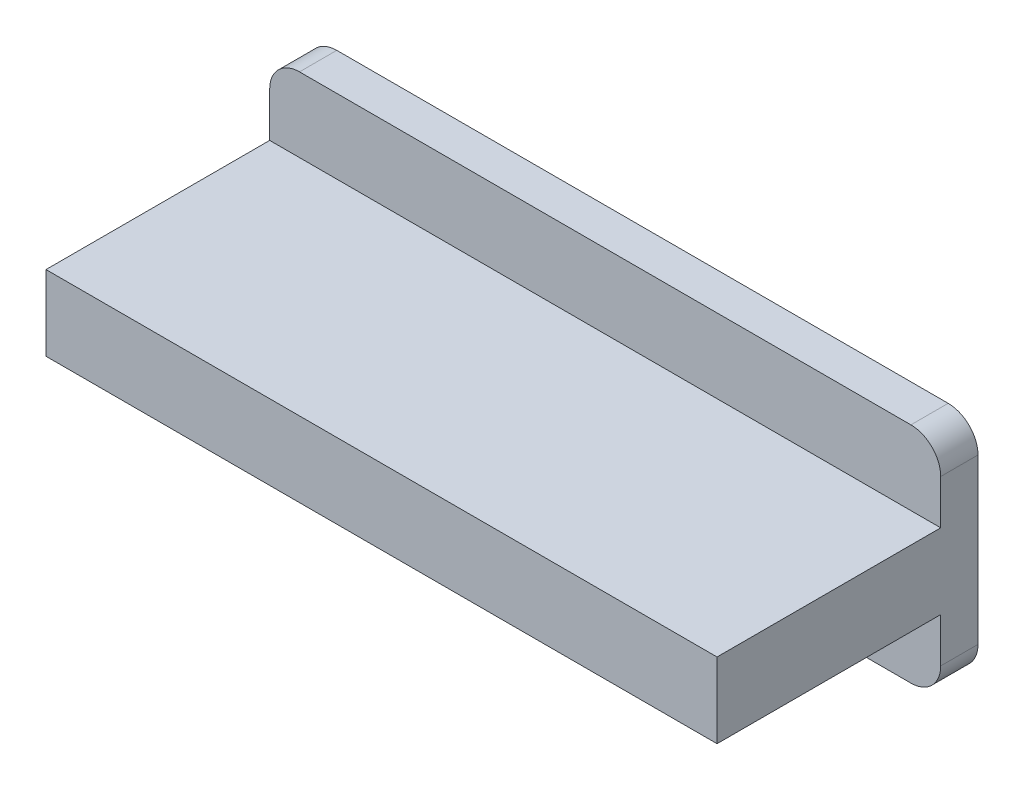
ISO-10303-21;
HEADER;
FILE_DESCRIPTION(('STEP AP214'),'2;1');
FILE_NAME('part.step','',(''),(''),'','','');
FILE_SCHEMA(('AUTOMOTIVE_DESIGN { 1 0 10303 214 1 1 1 1 }'));
ENDSEC;
DATA;
#1=APPLICATION_CONTEXT('core data for automotive mechanical design processes');
#2=APPLICATION_PROTOCOL_DEFINITION('international standard','automotive_design',2000,#1);
#3=PRODUCT_CONTEXT('',#1,'mechanical');
#4=PRODUCT('Part','Part','',(#3));
#5=PRODUCT_RELATED_PRODUCT_CATEGORY('part','',(#4));
#6=PRODUCT_DEFINITION_FORMATION('','',#4);
#7=PRODUCT_DEFINITION_CONTEXT('part definition',#1,'design');
#8=PRODUCT_DEFINITION('design','',#6,#7);
#9=PRODUCT_DEFINITION_SHAPE('','',#8);
#10=(LENGTH_UNIT() NAMED_UNIT(*) SI_UNIT(.MILLI.,.METRE.));
#11=(NAMED_UNIT(*) PLANE_ANGLE_UNIT() SI_UNIT($,.RADIAN.));
#12=(NAMED_UNIT(*) SI_UNIT($,.STERADIAN.) SOLID_ANGLE_UNIT());
#13=UNCERTAINTY_MEASURE_WITH_UNIT(LENGTH_MEASURE(1.E-05),#10,'distance_accuracy_value','');
#14=(GEOMETRIC_REPRESENTATION_CONTEXT(3) GLOBAL_UNCERTAINTY_ASSIGNED_CONTEXT((#13)) GLOBAL_UNIT_ASSIGNED_CONTEXT((#10,
#11,#12)) REPRESENTATION_CONTEXT('',''));
#15=CARTESIAN_POINT('',(0.,0.,0.));
#16=DIRECTION('',(0.,0.,1.));
#17=DIRECTION('',(1.,0.,0.));
#18=AXIS2_PLACEMENT_3D('',#15,#16,#17);
#19=CARTESIAN_POINT('',(0.,0.,3.175));
#20=DIRECTION('',(0.,0.,-1.));
#21=DIRECTION('',(-1.,0.,0.));
#22=AXIS2_PLACEMENT_3D('',#19,#20,#21);
#23=PLANE('',#22);
#24=DIRECTION('',(0.,-1.,0.));
#25=VECTOR('',#24,1.);
#26=CARTESIAN_POINT('',(-28.575,-9.525,3.175));
#27=LINE('',#26,#25);
#28=CARTESIAN_POINT('',(-28.575,-3.19935897435899,3.175));
#29=VERTEX_POINT('',#28);
#30=CARTESIAN_POINT('',(-28.575,-6.985,3.175));
#31=VERTEX_POINT('',#30);
#32=EDGE_CURVE('E169',#29,#31,#27,.T.);
#33=ORIENTED_EDGE('',*,*,#32,.T.);
#34=CARTESIAN_POINT('',(-26.035,-6.985,3.175));
#35=DIRECTION('',(0.,0.,-1.));
#36=DIRECTION('',(-1.,0.,0.));
#37=AXIS2_PLACEMENT_3D('',#34,#35,#36);
#38=CIRCLE('',#37,2.54);
#39=CARTESIAN_POINT('',(-26.035,-9.525,3.175));
#40=VERTEX_POINT('',#39);
#41=EDGE_CURVE('E202',#31,#40,#38,.F.);
#42=ORIENTED_EDGE('',*,*,#41,.T.);
#43=DIRECTION('',(1.,0.,0.));
#44=VECTOR('',#43,1.);
#45=CARTESIAN_POINT('',(-28.575,-9.525,3.175));
#46=LINE('',#45,#44);
#47=CARTESIAN_POINT('',(26.035,-9.525,3.175));
#48=VERTEX_POINT('',#47);
#49=EDGE_CURVE('E172',#40,#48,#46,.T.);
#50=ORIENTED_EDGE('',*,*,#49,.T.);
#51=CARTESIAN_POINT('',(26.035,-6.985,3.175));
#52=DIRECTION('',(0.,0.,-1.));
#53=DIRECTION('',(-1.,0.,0.));
#54=AXIS2_PLACEMENT_3D('',#51,#52,#53);
#55=CIRCLE('',#54,2.54);
#56=CARTESIAN_POINT('',(28.575,-6.985,3.175));
#57=VERTEX_POINT('',#56);
#58=EDGE_CURVE('E200',#48,#57,#55,.F.);
#59=ORIENTED_EDGE('',*,*,#58,.T.);
#60=DIRECTION('',(0.,1.,0.));
#61=VECTOR('',#60,1.);
#62=CARTESIAN_POINT('',(28.575,-9.525,3.175));
#63=LINE('',#62,#61);
#64=CARTESIAN_POINT('',(28.575,-3.19935897435899,3.175));
#65=VERTEX_POINT('',#64);
#66=EDGE_CURVE('E165',#57,#65,#63,.T.);
#67=ORIENTED_EDGE('',*,*,#66,.T.);
#68=DIRECTION('',(1.,0.,0.));
#69=VECTOR('',#68,1.);
#70=CARTESIAN_POINT('',(-28.575,-3.19935897435899,3.175));
#71=LINE('',#70,#69);
#72=EDGE_CURVE('E153',#29,#65,#71,.T.);
#73=ORIENTED_EDGE('',*,*,#72,.F.);
#74=EDGE_LOOP('',(#33,#42,#50,#59,#67,#73));
#75=FACE_BOUND('',#74,.T.);
#76=ADVANCED_FACE('F43',(#75),#23,.F.);
#77=DIRECTION('',(-1.,0.,0.));
#78=VECTOR('',#77,1.);
#79=CARTESIAN_POINT('',(-28.575,9.525,3.175));
#80=LINE('',#79,#78);
#81=CARTESIAN_POINT('',(26.035,9.525,3.175));
#82=VERTEX_POINT('',#81);
#83=CARTESIAN_POINT('',(-26.035,9.525,3.175));
#84=VERTEX_POINT('',#83);
#85=EDGE_CURVE('E167',#82,#84,#80,.T.);
#86=ORIENTED_EDGE('',*,*,#85,.T.);
#87=CARTESIAN_POINT('',(-26.035,6.985,3.175));
#88=DIRECTION('',(0.,0.,-1.));
#89=DIRECTION('',(-1.,0.,0.));
#90=AXIS2_PLACEMENT_3D('',#87,#88,#89);
#91=CIRCLE('',#90,2.54);
#92=CARTESIAN_POINT('',(-28.575,6.98499999999999,3.175));
#93=VERTEX_POINT('',#92);
#94=EDGE_CURVE('E210',#84,#93,#91,.F.);
#95=ORIENTED_EDGE('',*,*,#94,.T.);
#96=CARTESIAN_POINT('',(-28.575,3.19935897435899,3.175));
#97=VERTEX_POINT('',#96);
#98=EDGE_CURVE('E170',#93,#97,#27,.T.);
#99=ORIENTED_EDGE('',*,*,#98,.T.);
#100=DIRECTION('',(-1.,0.,0.));
#101=VECTOR('',#100,1.);
#102=CARTESIAN_POINT('',(-28.575,3.19935897435899,3.175));
#103=LINE('',#102,#101);
#104=CARTESIAN_POINT('',(28.575,3.19935897435898,3.175));
#105=VERTEX_POINT('',#104);
#106=EDGE_CURVE('E369',#105,#97,#103,.T.);
#107=ORIENTED_EDGE('',*,*,#106,.F.);
#108=CARTESIAN_POINT('',(28.575,6.98499999999999,3.175));
#109=VERTEX_POINT('',#108);
#110=EDGE_CURVE('E156',#105,#109,#63,.T.);
#111=ORIENTED_EDGE('',*,*,#110,.T.);
#112=CARTESIAN_POINT('',(26.035,6.985,3.175));
#113=DIRECTION('',(0.,0.,-1.));
#114=DIRECTION('',(-1.,0.,0.));
#115=AXIS2_PLACEMENT_3D('',#112,#113,#114);
#116=CIRCLE('',#115,2.54);
#117=EDGE_CURVE('E208',#109,#82,#116,.F.);
#118=ORIENTED_EDGE('',*,*,#117,.T.);
#119=EDGE_LOOP('',(#86,#95,#99,#107,#111,#118));
#120=FACE_BOUND('',#119,.T.);
#121=ADVANCED_FACE('F228',(#120),#23,.F.);
#122=CARTESIAN_POINT('',(28.575,-9.525,3.175));
#123=DIRECTION('',(-1.,0.,0.));
#124=DIRECTION('',(0.,0.,1.));
#125=AXIS2_PLACEMENT_3D('',#122,#123,#124);
#126=PLANE('',#125);
#127=DIRECTION('',(0.,1.,0.));
#128=VECTOR('',#127,1.);
#129=CARTESIAN_POINT('',(28.575,-9.525,0.));
#130=LINE('',#129,#128);
#131=CARTESIAN_POINT('',(28.575,-6.985,0.));
#132=VERTEX_POINT('',#131);
#133=CARTESIAN_POINT('',(28.575,6.98499999999999,0.));
#134=VERTEX_POINT('',#133);
#135=EDGE_CURVE('E157',#132,#134,#130,.T.);
#136=ORIENTED_EDGE('',*,*,#135,.T.);
#137=DIRECTION('',(0.,0.,-1.));
#138=VECTOR('',#137,1.);
#139=CARTESIAN_POINT('',(28.575,6.985,3.175));
#140=LINE('',#139,#138);
#141=EDGE_CURVE('E11',#134,#109,#140,.F.);
#142=ORIENTED_EDGE('',*,*,#141,.T.);
#143=ORIENTED_EDGE('',*,*,#110,.F.);
#144=DIRECTION('',(0.,0.,-1.));
#145=VECTOR('',#144,1.);
#146=CARTESIAN_POINT('',(28.575,3.19935897435899,22.225));
#147=LINE('',#146,#145);
#148=CARTESIAN_POINT('',(28.575,3.19935897435899,22.225));
#149=VERTEX_POINT('',#148);
#150=EDGE_CURVE('E139',#149,#105,#147,.T.);
#151=ORIENTED_EDGE('',*,*,#150,.F.);
#152=DIRECTION('',(0.,1.,0.));
#153=VECTOR('',#152,1.);
#154=CARTESIAN_POINT('',(28.575,-3.19935897435899,22.225));
#155=LINE('',#154,#153);
#156=CARTESIAN_POINT('',(28.575,-3.19935897435899,22.225));
#157=VERTEX_POINT('',#156);
#158=EDGE_CURVE('E145',#157,#149,#155,.T.);
#159=ORIENTED_EDGE('',*,*,#158,.F.);
#160=DIRECTION('',(0.,0.,-1.));
#161=VECTOR('',#160,1.);
#162=CARTESIAN_POINT('',(28.575,-3.19935897435899,22.225));
#163=LINE('',#162,#161);
#164=EDGE_CURVE('E366',#157,#65,#163,.T.);
#165=ORIENTED_EDGE('',*,*,#164,.T.);
#166=ORIENTED_EDGE('',*,*,#66,.F.);
#167=DIRECTION('',(0.,0.,-1.));
#168=VECTOR('',#167,1.);
#169=CARTESIAN_POINT('',(28.575,-6.985,3.175));
#170=LINE('',#169,#168);
#171=EDGE_CURVE('E51',#57,#132,#170,.T.);
#172=ORIENTED_EDGE('',*,*,#171,.T.);
#173=EDGE_LOOP('',(#136,#142,#143,#151,#159,#165,#166,#172));
#174=FACE_BOUND('',#173,.T.);
#175=ADVANCED_FACE('F155',(#174),#126,.F.);
#176=CARTESIAN_POINT('',(-28.575,9.525,3.175));
#177=DIRECTION('',(0.,-1.,0.));
#178=DIRECTION('',(0.,0.,-1.));
#179=AXIS2_PLACEMENT_3D('',#176,#177,#178);
#180=PLANE('',#179);
#181=DIRECTION('',(-1.,0.,0.));
#182=VECTOR('',#181,1.);
#183=CARTESIAN_POINT('',(-28.575,9.525,0.));
#184=LINE('',#183,#182);
#185=CARTESIAN_POINT('',(26.035,9.525,0.));
#186=VERTEX_POINT('',#185);
#187=CARTESIAN_POINT('',(-26.035,9.525,0.));
#188=VERTEX_POINT('',#187);
#189=EDGE_CURVE('E159',#186,#188,#184,.T.);
#190=ORIENTED_EDGE('',*,*,#189,.T.);
#191=DIRECTION('',(0.,0.,-1.));
#192=VECTOR('',#191,1.);
#193=CARTESIAN_POINT('',(-26.035,9.525,3.175));
#194=LINE('',#193,#192);
#195=EDGE_CURVE('E64',#188,#84,#194,.F.);
#196=ORIENTED_EDGE('',*,*,#195,.T.);
#197=ORIENTED_EDGE('',*,*,#85,.F.);
#198=DIRECTION('',(0.,0.,-1.));
#199=VECTOR('',#198,1.);
#200=CARTESIAN_POINT('',(26.035,9.525,3.175));
#201=LINE('',#200,#199);
#202=EDGE_CURVE('E204',#82,#186,#201,.T.);
#203=ORIENTED_EDGE('',*,*,#202,.T.);
#204=EDGE_LOOP('',(#190,#196,#197,#203));
#205=FACE_BOUND('',#204,.T.);
#206=ADVANCED_FACE('F225',(#205),#180,.F.);
#207=CARTESIAN_POINT('',(-28.575,-9.525,3.175));
#208=DIRECTION('',(1.,0.,0.));
#209=DIRECTION('',(0.,0.,-1.));
#210=AXIS2_PLACEMENT_3D('',#207,#208,#209);
#211=PLANE('',#210);
#212=DIRECTION('',(0.,-1.,0.));
#213=VECTOR('',#212,1.);
#214=CARTESIAN_POINT('',(-28.575,-9.525,0.));
#215=LINE('',#214,#213);
#216=CARTESIAN_POINT('',(-28.575,6.98499999999999,0.));
#217=VERTEX_POINT('',#216);
#218=CARTESIAN_POINT('',(-28.575,-6.985,0.));
#219=VERTEX_POINT('',#218);
#220=EDGE_CURVE('E177',#217,#219,#215,.T.);
#221=ORIENTED_EDGE('',*,*,#220,.T.);
#222=DIRECTION('',(0.,0.,-1.));
#223=VECTOR('',#222,1.);
#224=CARTESIAN_POINT('',(-28.575,-6.985,3.175));
#225=LINE('',#224,#223);
#226=EDGE_CURVE('E198',#219,#31,#225,.F.);
#227=ORIENTED_EDGE('',*,*,#226,.T.);
#228=ORIENTED_EDGE('',*,*,#32,.F.);
#229=DIRECTION('',(0.,0.,-1.));
#230=VECTOR('',#229,1.);
#231=CARTESIAN_POINT('',(-28.575,-3.19935897435899,22.225));
#232=LINE('',#231,#230);
#233=CARTESIAN_POINT('',(-28.575,-3.19935897435899,22.225));
#234=VERTEX_POINT('',#233);
#235=EDGE_CURVE('E161',#234,#29,#232,.T.);
#236=ORIENTED_EDGE('',*,*,#235,.F.);
#237=DIRECTION('',(0.,-1.,0.));
#238=VECTOR('',#237,1.);
#239=CARTESIAN_POINT('',(-28.575,-3.19935897435899,22.225));
#240=LINE('',#239,#238);
#241=CARTESIAN_POINT('',(-28.575,3.19935897435899,22.225));
#242=VERTEX_POINT('',#241);
#243=EDGE_CURVE('E144',#242,#234,#240,.T.);
#244=ORIENTED_EDGE('',*,*,#243,.F.);
#245=DIRECTION('',(0.,0.,-1.));
#246=VECTOR('',#245,1.);
#247=CARTESIAN_POINT('',(-28.575,3.19935897435899,22.225));
#248=LINE('',#247,#246);
#249=EDGE_CURVE('E141',#242,#97,#248,.T.);
#250=ORIENTED_EDGE('',*,*,#249,.T.);
#251=ORIENTED_EDGE('',*,*,#98,.F.);
#252=DIRECTION('',(0.,0.,-1.));
#253=VECTOR('',#252,1.);
#254=CARTESIAN_POINT('',(-28.575,6.985,3.175));
#255=LINE('',#254,#253);
#256=EDGE_CURVE('E195',#93,#217,#255,.T.);
#257=ORIENTED_EDGE('',*,*,#256,.T.);
#258=EDGE_LOOP('',(#221,#227,#228,#236,#244,#250,#251,#257));
#259=FACE_BOUND('',#258,.T.);
#260=ADVANCED_FACE('F235',(#259),#211,.F.);
#261=CARTESIAN_POINT('',(-28.575,-9.525,3.175));
#262=DIRECTION('',(0.,1.,0.));
#263=DIRECTION('',(0.,0.,1.));
#264=AXIS2_PLACEMENT_3D('',#261,#262,#263);
#265=PLANE('',#264);
#266=ORIENTED_EDGE('',*,*,#49,.F.);
#267=DIRECTION('',(0.,0.,-1.));
#268=VECTOR('',#267,1.);
#269=CARTESIAN_POINT('',(-26.035,-9.525,3.175));
#270=LINE('',#269,#268);
#271=CARTESIAN_POINT('',(-26.035,-9.525,0.));
#272=VERTEX_POINT('',#271);
#273=EDGE_CURVE('E184',#40,#272,#270,.T.);
#274=ORIENTED_EDGE('',*,*,#273,.T.);
#275=DIRECTION('',(1.,0.,0.));
#276=VECTOR('',#275,1.);
#277=CARTESIAN_POINT('',(-28.575,-9.525,0.));
#278=LINE('',#277,#276);
#279=CARTESIAN_POINT('',(26.035,-9.525,0.));
#280=VERTEX_POINT('',#279);
#281=EDGE_CURVE('E180',#272,#280,#278,.T.);
#282=ORIENTED_EDGE('',*,*,#281,.T.);
#283=DIRECTION('',(0.,0.,-1.));
#284=VECTOR('',#283,1.);
#285=CARTESIAN_POINT('',(26.035,-9.525,3.175));
#286=LINE('',#285,#284);
#287=EDGE_CURVE('E174',#280,#48,#286,.F.);
#288=ORIENTED_EDGE('',*,*,#287,.T.);
#289=EDGE_LOOP('',(#266,#274,#282,#288));
#290=FACE_BOUND('',#289,.T.);
#291=ADVANCED_FACE('F243',(#290),#265,.F.);
#292=CARTESIAN_POINT('',(0.,0.,0.));
#293=DIRECTION('',(0.,0.,-1.));
#294=DIRECTION('',(-1.,0.,0.));
#295=AXIS2_PLACEMENT_3D('',#292,#293,#294);
#296=PLANE('',#295);
#297=ORIENTED_EDGE('',*,*,#281,.F.);
#298=CARTESIAN_POINT('',(-26.035,-6.985,0.));
#299=DIRECTION('',(0.,0.,-1.));
#300=DIRECTION('',(-1.,0.,0.));
#301=AXIS2_PLACEMENT_3D('',#298,#299,#300);
#302=CIRCLE('',#301,2.54);
#303=EDGE_CURVE('E193',#272,#219,#302,.T.);
#304=ORIENTED_EDGE('',*,*,#303,.T.);
#305=ORIENTED_EDGE('',*,*,#220,.F.);
#306=CARTESIAN_POINT('',(-26.035,6.985,0.));
#307=DIRECTION('',(0.,0.,-1.));
#308=DIRECTION('',(-1.,0.,0.));
#309=AXIS2_PLACEMENT_3D('',#306,#307,#308);
#310=CIRCLE('',#309,2.54);
#311=EDGE_CURVE('E191',#217,#188,#310,.T.);
#312=ORIENTED_EDGE('',*,*,#311,.T.);
#313=ORIENTED_EDGE('',*,*,#189,.F.);
#314=CARTESIAN_POINT('',(26.035,6.985,0.));
#315=DIRECTION('',(0.,0.,-1.));
#316=DIRECTION('',(-1.,0.,0.));
#317=AXIS2_PLACEMENT_3D('',#314,#315,#316);
#318=CIRCLE('',#317,2.54);
#319=EDGE_CURVE('E189',#186,#134,#318,.T.);
#320=ORIENTED_EDGE('',*,*,#319,.T.);
#321=ORIENTED_EDGE('',*,*,#135,.F.);
#322=CARTESIAN_POINT('',(26.035,-6.985,0.));
#323=DIRECTION('',(0.,0.,-1.));
#324=DIRECTION('',(-1.,0.,0.));
#325=AXIS2_PLACEMENT_3D('',#322,#323,#324);
#326=CIRCLE('',#325,2.54);
#327=EDGE_CURVE('E187',#132,#280,#326,.T.);
#328=ORIENTED_EDGE('',*,*,#327,.T.);
#329=EDGE_LOOP('',(#297,#304,#305,#312,#313,#320,#321,#328));
#330=FACE_BOUND('',#329,.T.);
#331=ADVANCED_FACE('F219',(#330),#296,.T.);
#332=CARTESIAN_POINT('',(-28.575,3.19935897435899,22.225));
#333=DIRECTION('',(0.,-1.,0.));
#334=DIRECTION('',(0.,0.,-1.));
#335=AXIS2_PLACEMENT_3D('',#332,#333,#334);
#336=PLANE('',#335);
#337=ORIENTED_EDGE('',*,*,#106,.T.);
#338=ORIENTED_EDGE('',*,*,#249,.F.);
#339=DIRECTION('',(-1.,0.,0.));
#340=VECTOR('',#339,1.);
#341=CARTESIAN_POINT('',(-28.575,3.19935897435899,22.225));
#342=LINE('',#341,#340);
#343=EDGE_CURVE('E134',#149,#242,#342,.T.);
#344=ORIENTED_EDGE('',*,*,#343,.F.);
#345=ORIENTED_EDGE('',*,*,#150,.T.);
#346=EDGE_LOOP('',(#337,#338,#344,#345));
#347=FACE_BOUND('',#346,.T.);
#348=ADVANCED_FACE('F137',(#347),#336,.F.);
#349=CARTESIAN_POINT('',(-28.575,-3.19935897435899,22.225));
#350=DIRECTION('',(0.,1.,0.));
#351=DIRECTION('',(0.,0.,1.));
#352=AXIS2_PLACEMENT_3D('',#349,#350,#351);
#353=PLANE('',#352);
#354=ORIENTED_EDGE('',*,*,#72,.T.);
#355=ORIENTED_EDGE('',*,*,#164,.F.);
#356=DIRECTION('',(1.,0.,0.));
#357=VECTOR('',#356,1.);
#358=CARTESIAN_POINT('',(-28.575,-3.19935897435899,22.225));
#359=LINE('',#358,#357);
#360=EDGE_CURVE('E150',#234,#157,#359,.T.);
#361=ORIENTED_EDGE('',*,*,#360,.F.);
#362=ORIENTED_EDGE('',*,*,#235,.T.);
#363=EDGE_LOOP('',(#354,#355,#361,#362));
#364=FACE_BOUND('',#363,.T.);
#365=ADVANCED_FACE('F299',(#364),#353,.F.);
#366=CARTESIAN_POINT('',(0.,0.,22.225));
#367=DIRECTION('',(0.,0.,-1.));
#368=DIRECTION('',(-1.,0.,0.));
#369=AXIS2_PLACEMENT_3D('',#366,#367,#368);
#370=PLANE('',#369);
#371=ORIENTED_EDGE('',*,*,#158,.T.);
#372=ORIENTED_EDGE('',*,*,#343,.T.);
#373=ORIENTED_EDGE('',*,*,#243,.T.);
#374=ORIENTED_EDGE('',*,*,#360,.T.);
#375=EDGE_LOOP('',(#371,#372,#373,#374));
#376=FACE_BOUND('',#375,.T.);
#377=ADVANCED_FACE('F148',(#376),#370,.F.);
#378=CARTESIAN_POINT('',(-26.035,-6.985,3.175));
#379=DIRECTION('',(0.,0.,-1.));
#380=DIRECTION('',(-1.,0.,0.));
#381=AXIS2_PLACEMENT_3D('',#378,#379,#380);
#382=CYLINDRICAL_SURFACE('',#381,2.54);
#383=ORIENTED_EDGE('',*,*,#41,.F.);
#384=ORIENTED_EDGE('',*,*,#226,.F.);
#385=ORIENTED_EDGE('',*,*,#303,.F.);
#386=ORIENTED_EDGE('',*,*,#273,.F.);
#387=EDGE_LOOP('',(#383,#384,#385,#386));
#388=FACE_BOUND('',#387,.T.);
#389=ADVANCED_FACE('F240',(#388),#382,.T.);
#390=CARTESIAN_POINT('',(-26.035,6.985,3.175));
#391=DIRECTION('',(0.,0.,-1.));
#392=DIRECTION('',(-1.,0.,0.));
#393=AXIS2_PLACEMENT_3D('',#390,#391,#392);
#394=CYLINDRICAL_SURFACE('',#393,2.54);
#395=ORIENTED_EDGE('',*,*,#94,.F.);
#396=ORIENTED_EDGE('',*,*,#195,.F.);
#397=ORIENTED_EDGE('',*,*,#311,.F.);
#398=ORIENTED_EDGE('',*,*,#256,.F.);
#399=EDGE_LOOP('',(#395,#396,#397,#398));
#400=FACE_BOUND('',#399,.T.);
#401=ADVANCED_FACE('F232',(#400),#394,.T.);
#402=CARTESIAN_POINT('',(26.035,6.985,3.175));
#403=DIRECTION('',(0.,0.,-1.));
#404=DIRECTION('',(-1.,0.,0.));
#405=AXIS2_PLACEMENT_3D('',#402,#403,#404);
#406=CYLINDRICAL_SURFACE('',#405,2.54);
#407=ORIENTED_EDGE('',*,*,#117,.F.);
#408=ORIENTED_EDGE('',*,*,#141,.F.);
#409=ORIENTED_EDGE('',*,*,#319,.F.);
#410=ORIENTED_EDGE('',*,*,#202,.F.);
#411=EDGE_LOOP('',(#407,#408,#409,#410));
#412=FACE_BOUND('',#411,.T.);
#413=ADVANCED_FACE('F224',(#412),#406,.T.);
#414=CARTESIAN_POINT('',(26.035,-6.985,3.175));
#415=DIRECTION('',(0.,0.,-1.));
#416=DIRECTION('',(-1.,0.,0.));
#417=AXIS2_PLACEMENT_3D('',#414,#415,#416);
#418=CYLINDRICAL_SURFACE('',#417,2.54);
#419=ORIENTED_EDGE('',*,*,#58,.F.);
#420=ORIENTED_EDGE('',*,*,#287,.F.);
#421=ORIENTED_EDGE('',*,*,#327,.F.);
#422=ORIENTED_EDGE('',*,*,#171,.F.);
#423=EDGE_LOOP('',(#419,#420,#421,#422));
#424=FACE_BOUND('',#423,.T.);
#425=ADVANCED_FACE('F45',(#424),#418,.T.);
#426=CLOSED_SHELL('',(#76,#121,#175,#206,#260,#291,#331,#348,#365,#377,#389,#401,#413,#425));
#427=MANIFOLD_SOLID_BREP('B2',#426);
#428=ADVANCED_BREP_SHAPE_REPRESENTATION('',(#18,#427),#14);
#429=SHAPE_DEFINITION_REPRESENTATION(#9,#428);
ENDSEC;
END-ISO-10303-21;
